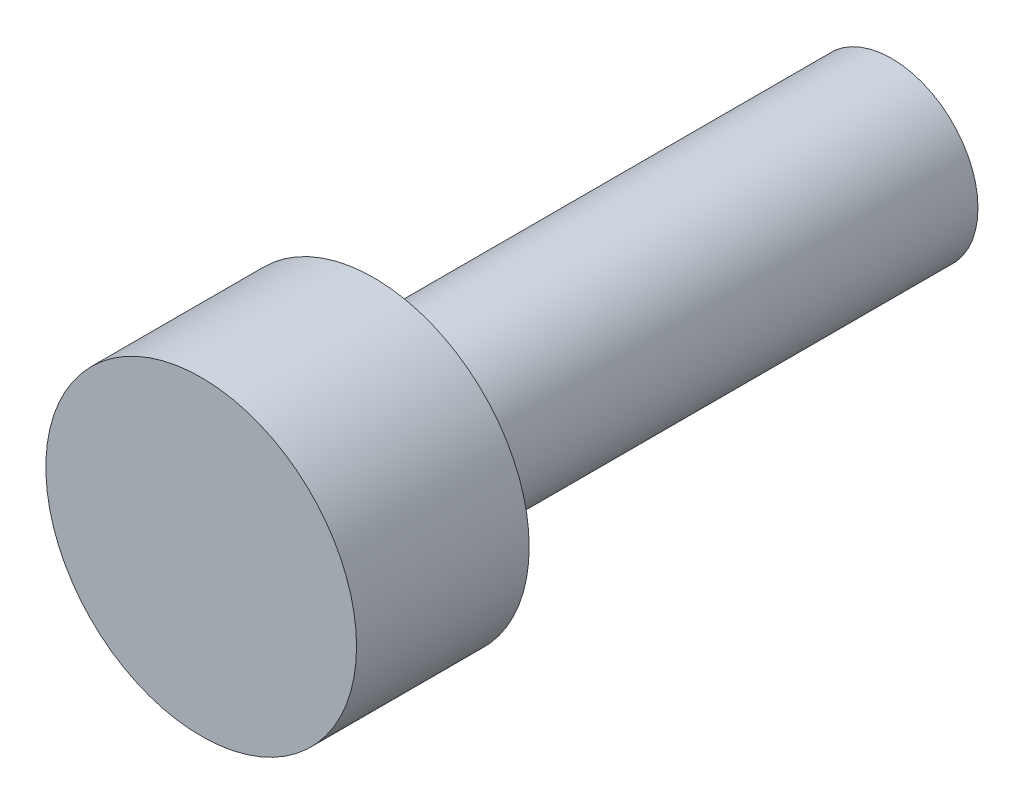
ISO-10303-21;
HEADER;
FILE_DESCRIPTION(('STEP AP214'),'2;1');
FILE_NAME('part.step','',(''),(''),'','','');
FILE_SCHEMA(('AUTOMOTIVE_DESIGN { 1 0 10303 214 1 1 1 1 }'));
ENDSEC;
DATA;
#1=APPLICATION_CONTEXT('core data for automotive mechanical design processes');
#2=APPLICATION_PROTOCOL_DEFINITION('international standard','automotive_design',2000,#1);
#3=PRODUCT_CONTEXT('',#1,'mechanical');
#4=PRODUCT('Part','Part','',(#3));
#5=PRODUCT_RELATED_PRODUCT_CATEGORY('part','',(#4));
#6=PRODUCT_DEFINITION_FORMATION('','',#4);
#7=PRODUCT_DEFINITION_CONTEXT('part definition',#1,'design');
#8=PRODUCT_DEFINITION('design','',#6,#7);
#9=PRODUCT_DEFINITION_SHAPE('','',#8);
#10=(LENGTH_UNIT() NAMED_UNIT(*) SI_UNIT(.MILLI.,.METRE.));
#11=(NAMED_UNIT(*) PLANE_ANGLE_UNIT() SI_UNIT($,.RADIAN.));
#12=(NAMED_UNIT(*) SI_UNIT($,.STERADIAN.) SOLID_ANGLE_UNIT());
#13=UNCERTAINTY_MEASURE_WITH_UNIT(LENGTH_MEASURE(1.E-05),#10,'distance_accuracy_value','');
#14=(GEOMETRIC_REPRESENTATION_CONTEXT(3) GLOBAL_UNCERTAINTY_ASSIGNED_CONTEXT((#13)) GLOBAL_UNIT_ASSIGNED_CONTEXT((#10,
#11,#12)) REPRESENTATION_CONTEXT('',''));
#15=CARTESIAN_POINT('',(0.,0.,0.));
#16=DIRECTION('',(0.,0.,1.));
#17=DIRECTION('',(1.,0.,0.));
#18=AXIS2_PLACEMENT_3D('',#15,#16,#17);
#19=CARTESIAN_POINT('',(0.,0.,6.));
#20=DIRECTION('',(0.,0.,-1.));
#21=DIRECTION('',(-1.,0.,0.));
#22=AXIS2_PLACEMENT_3D('',#19,#20,#21);
#23=CYLINDRICAL_SURFACE('',#22,1.);
#24=CARTESIAN_POINT('',(0.,0.,6.));
#25=DIRECTION('',(0.,0.,1.));
#26=DIRECTION('',(1.,0.,0.));
#27=AXIS2_PLACEMENT_3D('',#24,#25,#26);
#28=CIRCLE('',#27,1.);
#29=CARTESIAN_POINT('',(1.,0.,6.));
#30=VERTEX_POINT('',#29);
#31=EDGE_CURVE('E10',#30,#30,#28,.T.);
#32=ORIENTED_EDGE('',*,*,#31,.F.);
#33=EDGE_LOOP('',(#32));
#34=FACE_BOUND('',#33,.T.);
#35=CARTESIAN_POINT('',(0.,0.,0.));
#36=DIRECTION('',(0.,0.,1.));
#37=DIRECTION('',(1.,0.,0.));
#38=AXIS2_PLACEMENT_3D('',#35,#36,#37);
#39=CIRCLE('',#38,1.);
#40=CARTESIAN_POINT('',(1.,0.,0.));
#41=VERTEX_POINT('',#40);
#42=EDGE_CURVE('E40',#41,#41,#39,.T.);
#43=ORIENTED_EDGE('',*,*,#42,.T.);
#44=EDGE_LOOP('',(#43));
#45=FACE_BOUND('',#44,.T.);
#46=ADVANCED_FACE('F37',(#34,#45),#23,.T.);
#47=CARTESIAN_POINT('',(0.,0.,0.));
#48=DIRECTION('',(0.,0.,1.));
#49=DIRECTION('',(1.,0.,0.));
#50=AXIS2_PLACEMENT_3D('',#47,#48,#49);
#51=PLANE('',#50);
#52=ORIENTED_EDGE('',*,*,#42,.F.);
#53=EDGE_LOOP('',(#52));
#54=FACE_BOUND('',#53,.T.);
#55=ADVANCED_FACE('F60',(#54),#51,.F.);
#56=CARTESIAN_POINT('',(0.,0.,8.));
#57=DIRECTION('',(0.,0.,-1.));
#58=DIRECTION('',(-1.,0.,0.));
#59=AXIS2_PLACEMENT_3D('',#56,#57,#58);
#60=CYLINDRICAL_SURFACE('',#59,1.8);
#61=CARTESIAN_POINT('',(0.,0.,8.));
#62=DIRECTION('',(0.,0.,1.));
#63=DIRECTION('',(1.,0.,0.));
#64=AXIS2_PLACEMENT_3D('',#61,#62,#63);
#65=CIRCLE('',#64,1.8);
#66=CARTESIAN_POINT('',(1.8,0.,8.));
#67=VERTEX_POINT('',#66);
#68=EDGE_CURVE('E47',#67,#67,#65,.T.);
#69=ORIENTED_EDGE('',*,*,#68,.F.);
#70=EDGE_LOOP('',(#69));
#71=FACE_BOUND('',#70,.T.);
#72=CARTESIAN_POINT('',(0.,0.,6.));
#73=DIRECTION('',(0.,0.,1.));
#74=DIRECTION('',(1.,0.,0.));
#75=AXIS2_PLACEMENT_3D('',#72,#73,#74);
#76=CIRCLE('',#75,1.8);
#77=CARTESIAN_POINT('',(1.8,0.,6.));
#78=VERTEX_POINT('',#77);
#79=EDGE_CURVE('E49',#78,#78,#76,.T.);
#80=ORIENTED_EDGE('',*,*,#79,.T.);
#81=EDGE_LOOP('',(#80));
#82=FACE_BOUND('',#81,.T.);
#83=ADVANCED_FACE('F57',(#71,#82),#60,.T.);
#84=CARTESIAN_POINT('',(0.,0.,8.));
#85=DIRECTION('',(0.,0.,1.));
#86=DIRECTION('',(1.,0.,0.));
#87=AXIS2_PLACEMENT_3D('',#84,#85,#86);
#88=PLANE('',#87);
#89=ORIENTED_EDGE('',*,*,#68,.T.);
#90=EDGE_LOOP('',(#89));
#91=FACE_BOUND('',#90,.T.);
#92=ADVANCED_FACE('F55',(#91),#88,.T.);
#93=CARTESIAN_POINT('',(0.,0.,6.));
#94=DIRECTION('',(0.,0.,1.));
#95=DIRECTION('',(1.,0.,0.));
#96=AXIS2_PLACEMENT_3D('',#93,#94,#95);
#97=PLANE('',#96);
#98=ORIENTED_EDGE('',*,*,#31,.T.);
#99=EDGE_LOOP('',(#98));
#100=FACE_BOUND('',#99,.T.);
#101=ORIENTED_EDGE('',*,*,#79,.F.);
#102=EDGE_LOOP('',(#101));
#103=FACE_BOUND('',#102,.T.);
#104=ADVANCED_FACE('F64',(#100,#103),#97,.F.);
#105=CLOSED_SHELL('',(#46,#55,#83,#92,#104));
#106=MANIFOLD_SOLID_BREP('B2',#105);
#107=ADVANCED_BREP_SHAPE_REPRESENTATION('',(#18,#106),#14);
#108=SHAPE_DEFINITION_REPRESENTATION(#9,#107);
ENDSEC;
END-ISO-10303-21;
